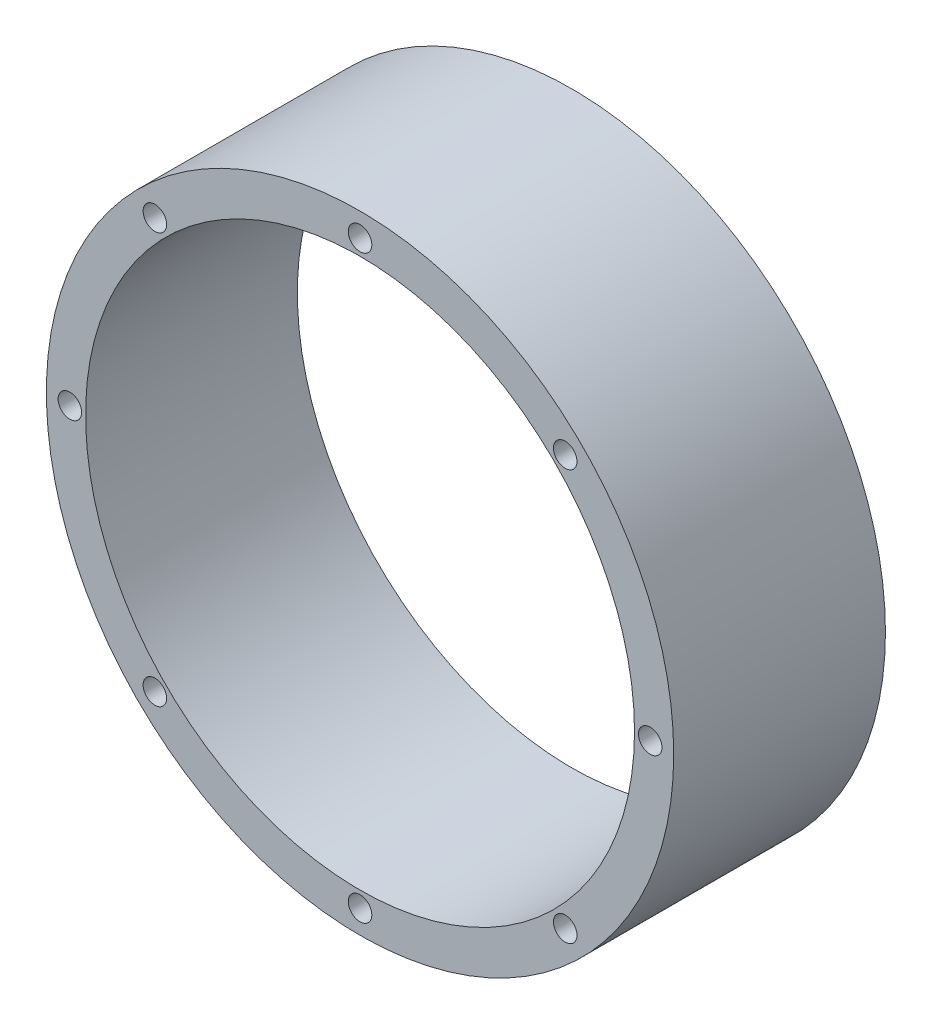
ISO-10303-21;
HEADER;
FILE_DESCRIPTION(('STEP AP214'),'2;1');
FILE_NAME('part.step','',(''),(''),'','','');
FILE_SCHEMA(('AUTOMOTIVE_DESIGN { 1 0 10303 214 1 1 1 1 }'));
ENDSEC;
DATA;
#1=APPLICATION_CONTEXT('core data for automotive mechanical design processes');
#2=APPLICATION_PROTOCOL_DEFINITION('international standard','automotive_design',2000,#1);
#3=PRODUCT_CONTEXT('',#1,'mechanical');
#4=PRODUCT('Part','Part','',(#3));
#5=PRODUCT_RELATED_PRODUCT_CATEGORY('part','',(#4));
#6=PRODUCT_DEFINITION_FORMATION('','',#4);
#7=PRODUCT_DEFINITION_CONTEXT('part definition',#1,'design');
#8=PRODUCT_DEFINITION('design','',#6,#7);
#9=PRODUCT_DEFINITION_SHAPE('','',#8);
#10=(LENGTH_UNIT() NAMED_UNIT(*) SI_UNIT(.MILLI.,.METRE.));
#11=(NAMED_UNIT(*) PLANE_ANGLE_UNIT() SI_UNIT($,.RADIAN.));
#12=(NAMED_UNIT(*) SI_UNIT($,.STERADIAN.) SOLID_ANGLE_UNIT());
#13=UNCERTAINTY_MEASURE_WITH_UNIT(LENGTH_MEASURE(1.E-05),#10,'distance_accuracy_value','');
#14=(GEOMETRIC_REPRESENTATION_CONTEXT(3) GLOBAL_UNCERTAINTY_ASSIGNED_CONTEXT((#13)) GLOBAL_UNIT_ASSIGNED_CONTEXT((#10,
#11,#12)) REPRESENTATION_CONTEXT('',''));
#15=CARTESIAN_POINT('',(0.,0.,0.));
#16=DIRECTION('',(0.,0.,1.));
#17=DIRECTION('',(1.,0.,0.));
#18=AXIS2_PLACEMENT_3D('',#15,#16,#17);
#19=CARTESIAN_POINT('',(0.,0.,27.));
#20=DIRECTION('',(0.,0.,1.));
#21=DIRECTION('',(1.,0.,0.));
#22=AXIS2_PLACEMENT_3D('',#19,#20,#21);
#23=PLANE('',#22);
#24=CARTESIAN_POINT('',(0.,37.,27.));
#25=DIRECTION('',(0.,0.,-1.));
#26=DIRECTION('',(-1.,0.,0.));
#27=AXIS2_PLACEMENT_3D('',#24,#25,#26);
#28=CIRCLE('',#27,1.5);
#29=CARTESIAN_POINT('',(-1.5,37.,27.));
#30=VERTEX_POINT('',#29);
#31=EDGE_CURVE('E143',#30,#30,#28,.T.);
#32=ORIENTED_EDGE('',*,*,#31,.T.);
#33=EDGE_LOOP('',(#32));
#34=FACE_BOUND('',#33,.T.);
#35=CARTESIAN_POINT('',(-26.1629509039018,26.1629509039011,27.));
#36=DIRECTION('',(0.,0.,-1.));
#37=DIRECTION('',(-1.,0.,0.));
#38=AXIS2_PLACEMENT_3D('',#35,#36,#37);
#39=CIRCLE('',#38,1.49999999999999);
#40=CARTESIAN_POINT('',(-27.6629509039018,26.1629509039011,27.));
#41=VERTEX_POINT('',#40);
#42=EDGE_CURVE('E131',#41,#41,#39,.T.);
#43=ORIENTED_EDGE('',*,*,#42,.T.);
#44=EDGE_LOOP('',(#43));
#45=FACE_BOUND('',#44,.T.);
#46=CARTESIAN_POINT('',(-36.9999999999984,-1.575139276809E-12,27.));
#47=DIRECTION('',(0.,0.,-1.));
#48=DIRECTION('',(-1.,0.,0.));
#49=AXIS2_PLACEMENT_3D('',#46,#47,#48);
#50=CIRCLE('',#49,1.49999999999999);
#51=CARTESIAN_POINT('',(-38.4999999999984,-1.575139276809E-12,27.));
#52=VERTEX_POINT('',#51);
#53=EDGE_CURVE('E119',#52,#52,#50,.T.);
#54=ORIENTED_EDGE('',*,*,#53,.T.);
#55=EDGE_LOOP('',(#54));
#56=FACE_BOUND('',#55,.T.);
#57=CARTESIAN_POINT('',(26.1629509039027,26.1629509039034,27.));
#58=DIRECTION('',(0.,0.,-1.));
#59=DIRECTION('',(-1.,0.,0.));
#60=AXIS2_PLACEMENT_3D('',#57,#58,#59);
#61=CIRCLE('',#60,1.49999999999999);
#62=CARTESIAN_POINT('',(24.6629509039027,26.1629509039034,27.));
#63=VERTEX_POINT('',#62);
#64=EDGE_CURVE('E107',#63,#63,#61,.T.);
#65=ORIENTED_EDGE('',*,*,#64,.T.);
#66=EDGE_LOOP('',(#65));
#67=FACE_BOUND('',#66,.T.);
#68=CARTESIAN_POINT('',(37.0000000000016,1.57060808365215E-12,27.));
#69=DIRECTION('',(0.,0.,-1.));
#70=DIRECTION('',(-1.,0.,0.));
#71=AXIS2_PLACEMENT_3D('',#68,#69,#70);
#72=CIRCLE('',#71,1.49999999999999);
#73=CARTESIAN_POINT('',(35.5000000000016,1.57060808365215E-12,27.));
#74=VERTEX_POINT('',#73);
#75=EDGE_CURVE('E95',#74,#74,#72,.T.);
#76=ORIENTED_EDGE('',*,*,#75,.T.);
#77=EDGE_LOOP('',(#76));
#78=FACE_BOUND('',#77,.T.);
#79=CARTESIAN_POINT('',(26.1629509039049,-26.1629509039011,27.));
#80=DIRECTION('',(0.,0.,-1.));
#81=DIRECTION('',(-1.,0.,0.));
#82=AXIS2_PLACEMENT_3D('',#79,#80,#81);
#83=CIRCLE('',#82,1.49999999999999);
#84=CARTESIAN_POINT('',(24.6629509039049,-26.1629509039011,27.));
#85=VERTEX_POINT('',#84);
#86=EDGE_CURVE('E83',#85,#85,#83,.T.);
#87=ORIENTED_EDGE('',*,*,#86,.T.);
#88=EDGE_LOOP('',(#87));
#89=FACE_BOUND('',#88,.T.);
#90=CARTESIAN_POINT('',(3.14121616730431E-12,-37.,27.));
#91=DIRECTION('',(0.,0.,-1.));
#92=DIRECTION('',(-1.,0.,0.));
#93=AXIS2_PLACEMENT_3D('',#90,#91,#92);
#94=CIRCLE('',#93,1.5);
#95=CARTESIAN_POINT('',(-1.49999999999685,-37.,27.));
#96=VERTEX_POINT('',#95);
#97=EDGE_CURVE('E71',#96,#96,#94,.T.);
#98=ORIENTED_EDGE('',*,*,#97,.T.);
#99=EDGE_LOOP('',(#98));
#100=FACE_BOUND('',#99,.T.);
#101=CARTESIAN_POINT('',(-26.1629509038996,-26.1629509039034,27.));
#102=DIRECTION('',(0.,0.,-1.));
#103=DIRECTION('',(-1.,0.,0.));
#104=AXIS2_PLACEMENT_3D('',#101,#102,#103);
#105=CIRCLE('',#104,1.49999999999999);
#106=CARTESIAN_POINT('',(-27.6629509038996,-26.1629509039034,27.));
#107=VERTEX_POINT('',#106);
#108=EDGE_CURVE('E56',#107,#107,#105,.T.);
#109=ORIENTED_EDGE('',*,*,#108,.T.);
#110=EDGE_LOOP('',(#109));
#111=FACE_BOUND('',#110,.T.);
#112=CARTESIAN_POINT('',(0.,0.,27.));
#113=DIRECTION('',(0.,0.,1.));
#114=DIRECTION('',(1.,0.,0.));
#115=AXIS2_PLACEMENT_3D('',#112,#113,#114);
#116=CIRCLE('',#115,40.);
#117=CARTESIAN_POINT('',(40.,0.,27.));
#118=VERTEX_POINT('',#117);
#119=EDGE_CURVE('E10',#118,#118,#116,.T.);
#120=ORIENTED_EDGE('',*,*,#119,.T.);
#121=EDGE_LOOP('',(#120));
#122=FACE_BOUND('',#121,.T.);
#123=CARTESIAN_POINT('',(0.,0.,27.));
#124=DIRECTION('',(0.,0.,1.));
#125=DIRECTION('',(1.,0.,0.));
#126=AXIS2_PLACEMENT_3D('',#123,#124,#125);
#127=CIRCLE('',#126,35.);
#128=CARTESIAN_POINT('',(35.,0.,27.));
#129=VERTEX_POINT('',#128);
#130=EDGE_CURVE('E50',#129,#129,#127,.T.);
#131=ORIENTED_EDGE('',*,*,#130,.F.);
#132=EDGE_LOOP('',(#131));
#133=FACE_BOUND('',#132,.T.);
#134=ADVANCED_FACE('F37',(#34,#45,#56,#67,#78,#89,#100,#111,#122,#133),#23,.T.);
#135=CARTESIAN_POINT('',(0.,0.,0.));
#136=DIRECTION('',(0.,0.,1.));
#137=DIRECTION('',(1.,0.,0.));
#138=AXIS2_PLACEMENT_3D('',#135,#136,#137);
#139=PLANE('',#138);
#140=CARTESIAN_POINT('',(0.,37.,0.));
#141=DIRECTION('',(0.,0.,-1.));
#142=DIRECTION('',(-1.,0.,0.));
#143=AXIS2_PLACEMENT_3D('',#140,#141,#142);
#144=CIRCLE('',#143,1.525);
#145=CARTESIAN_POINT('',(-1.525,37.,0.));
#146=VERTEX_POINT('',#145);
#147=EDGE_CURVE('E151',#146,#146,#144,.T.);
#148=ORIENTED_EDGE('',*,*,#147,.F.);
#149=EDGE_LOOP('',(#148));
#150=FACE_BOUND('',#149,.T.);
#151=CARTESIAN_POINT('',(-26.1629509039018,26.1629509039011,0.));
#152=DIRECTION('',(0.,0.,-1.));
#153=DIRECTION('',(-1.,0.,0.));
#154=AXIS2_PLACEMENT_3D('',#151,#152,#153);
#155=CIRCLE('',#154,1.525);
#156=CARTESIAN_POINT('',(-27.6879509039018,26.1629509039011,0.));
#157=VERTEX_POINT('',#156);
#158=EDGE_CURVE('E139',#157,#157,#155,.T.);
#159=ORIENTED_EDGE('',*,*,#158,.F.);
#160=EDGE_LOOP('',(#159));
#161=FACE_BOUND('',#160,.T.);
#162=CARTESIAN_POINT('',(-36.9999999999984,-1.575139276809E-12,0.));
#163=DIRECTION('',(0.,0.,-1.));
#164=DIRECTION('',(-1.,0.,0.));
#165=AXIS2_PLACEMENT_3D('',#162,#163,#164);
#166=CIRCLE('',#165,1.525);
#167=CARTESIAN_POINT('',(-38.5249999999984,-1.575139276809E-12,0.));
#168=VERTEX_POINT('',#167);
#169=EDGE_CURVE('E127',#168,#168,#166,.T.);
#170=ORIENTED_EDGE('',*,*,#169,.F.);
#171=EDGE_LOOP('',(#170));
#172=FACE_BOUND('',#171,.T.);
#173=CARTESIAN_POINT('',(26.1629509039027,26.1629509039034,0.));
#174=DIRECTION('',(0.,0.,-1.));
#175=DIRECTION('',(-1.,0.,0.));
#176=AXIS2_PLACEMENT_3D('',#173,#174,#175);
#177=CIRCLE('',#176,1.525);
#178=CARTESIAN_POINT('',(24.6379509039027,26.1629509039034,0.));
#179=VERTEX_POINT('',#178);
#180=EDGE_CURVE('E115',#179,#179,#177,.T.);
#181=ORIENTED_EDGE('',*,*,#180,.F.);
#182=EDGE_LOOP('',(#181));
#183=FACE_BOUND('',#182,.T.);
#184=CARTESIAN_POINT('',(37.0000000000016,1.57060808365215E-12,0.));
#185=DIRECTION('',(0.,0.,-1.));
#186=DIRECTION('',(-1.,0.,0.));
#187=AXIS2_PLACEMENT_3D('',#184,#185,#186);
#188=CIRCLE('',#187,1.525);
#189=CARTESIAN_POINT('',(35.4750000000016,1.57060808365215E-12,0.));
#190=VERTEX_POINT('',#189);
#191=EDGE_CURVE('E103',#190,#190,#188,.T.);
#192=ORIENTED_EDGE('',*,*,#191,.F.);
#193=EDGE_LOOP('',(#192));
#194=FACE_BOUND('',#193,.T.);
#195=CARTESIAN_POINT('',(26.1629509039049,-26.1629509039011,0.));
#196=DIRECTION('',(0.,0.,-1.));
#197=DIRECTION('',(-1.,0.,0.));
#198=AXIS2_PLACEMENT_3D('',#195,#196,#197);
#199=CIRCLE('',#198,1.525);
#200=CARTESIAN_POINT('',(24.6379509039049,-26.1629509039011,0.));
#201=VERTEX_POINT('',#200);
#202=EDGE_CURVE('E91',#201,#201,#199,.T.);
#203=ORIENTED_EDGE('',*,*,#202,.F.);
#204=EDGE_LOOP('',(#203));
#205=FACE_BOUND('',#204,.T.);
#206=CARTESIAN_POINT('',(3.14121616730431E-12,-37.,0.));
#207=DIRECTION('',(0.,0.,-1.));
#208=DIRECTION('',(-1.,0.,0.));
#209=AXIS2_PLACEMENT_3D('',#206,#207,#208);
#210=CIRCLE('',#209,1.525);
#211=CARTESIAN_POINT('',(-1.52499999999686,-37.,0.));
#212=VERTEX_POINT('',#211);
#213=EDGE_CURVE('E79',#212,#212,#210,.T.);
#214=ORIENTED_EDGE('',*,*,#213,.F.);
#215=EDGE_LOOP('',(#214));
#216=FACE_BOUND('',#215,.T.);
#217=CARTESIAN_POINT('',(-26.1629509038996,-26.1629509039034,0.));
#218=DIRECTION('',(0.,0.,-1.));
#219=DIRECTION('',(-1.,0.,0.));
#220=AXIS2_PLACEMENT_3D('',#217,#218,#219);
#221=CIRCLE('',#220,1.525);
#222=CARTESIAN_POINT('',(-27.6879509038996,-26.1629509039034,0.));
#223=VERTEX_POINT('',#222);
#224=EDGE_CURVE('E67',#223,#223,#221,.T.);
#225=ORIENTED_EDGE('',*,*,#224,.F.);
#226=EDGE_LOOP('',(#225));
#227=FACE_BOUND('',#226,.T.);
#228=CARTESIAN_POINT('',(0.,0.,0.));
#229=DIRECTION('',(0.,0.,1.));
#230=DIRECTION('',(1.,0.,0.));
#231=AXIS2_PLACEMENT_3D('',#228,#229,#230);
#232=CIRCLE('',#231,40.);
#233=CARTESIAN_POINT('',(40.,0.,0.));
#234=VERTEX_POINT('',#233);
#235=EDGE_CURVE('E41',#234,#234,#232,.T.);
#236=ORIENTED_EDGE('',*,*,#235,.F.);
#237=EDGE_LOOP('',(#236));
#238=FACE_BOUND('',#237,.T.);
#239=CARTESIAN_POINT('',(0.,0.,0.));
#240=DIRECTION('',(0.,0.,1.));
#241=DIRECTION('',(1.,0.,0.));
#242=AXIS2_PLACEMENT_3D('',#239,#240,#241);
#243=CIRCLE('',#242,35.);
#244=CARTESIAN_POINT('',(35.,0.,0.));
#245=VERTEX_POINT('',#244);
#246=EDGE_CURVE('E52',#245,#245,#243,.T.);
#247=ORIENTED_EDGE('',*,*,#246,.T.);
#248=EDGE_LOOP('',(#247));
#249=FACE_BOUND('',#248,.T.);
#250=ADVANCED_FACE('F158',(#150,#161,#172,#183,#194,#205,#216,#227,#238,#249),#139,.F.);
#251=CARTESIAN_POINT('',(0.,0.,27.));
#252=DIRECTION('',(0.,0.,-1.));
#253=DIRECTION('',(-1.,0.,0.));
#254=AXIS2_PLACEMENT_3D('',#251,#252,#253);
#255=CYLINDRICAL_SURFACE('',#254,40.);
#256=ORIENTED_EDGE('',*,*,#119,.F.);
#257=EDGE_LOOP('',(#256));
#258=FACE_BOUND('',#257,.T.);
#259=ORIENTED_EDGE('',*,*,#235,.T.);
#260=EDGE_LOOP('',(#259));
#261=FACE_BOUND('',#260,.T.);
#262=ADVANCED_FACE('F39',(#258,#261),#255,.T.);
#263=CARTESIAN_POINT('',(0.,0.,27.));
#264=DIRECTION('',(0.,0.,-1.));
#265=DIRECTION('',(-1.,0.,0.));
#266=AXIS2_PLACEMENT_3D('',#263,#264,#265);
#267=CYLINDRICAL_SURFACE('',#266,35.);
#268=ORIENTED_EDGE('',*,*,#130,.T.);
#269=EDGE_LOOP('',(#268));
#270=FACE_BOUND('',#269,.T.);
#271=ORIENTED_EDGE('',*,*,#246,.F.);
#272=EDGE_LOOP('',(#271));
#273=FACE_BOUND('',#272,.T.);
#274=ADVANCED_FACE('F179',(#270,#273),#267,.F.);
#275=CARTESIAN_POINT('',(-26.1629509038996,-26.1629509039034,0.));
#276=DIRECTION('',(0.,0.,-1.));
#277=DIRECTION('',(-1.,0.,0.));
#278=AXIS2_PLACEMENT_3D('',#275,#276,#277);
#279=CYLINDRICAL_SURFACE('',#278,1.5);
#280=ORIENTED_EDGE('',*,*,#108,.F.);
#281=EDGE_LOOP('',(#280));
#282=FACE_BOUND('',#281,.T.);
#283=CARTESIAN_POINT('',(-26.1629509038996,-26.1629509039034,0.0250000000000007));
#284=DIRECTION('',(0.,0.,-1.));
#285=DIRECTION('',(-1.,0.,0.));
#286=AXIS2_PLACEMENT_3D('',#283,#284,#285);
#287=CIRCLE('',#286,1.5);
#288=CARTESIAN_POINT('',(-27.6629509038996,-26.1629509039034,0.0250000000000007));
#289=VERTEX_POINT('',#288);
#290=EDGE_CURVE('E63',#289,#289,#287,.T.);
#291=ORIENTED_EDGE('',*,*,#290,.T.);
#292=EDGE_LOOP('',(#291));
#293=FACE_BOUND('',#292,.T.);
#294=ADVANCED_FACE('F181',(#282,#293),#279,.F.);
#295=CARTESIAN_POINT('',(-26.1629509038996,-26.1629509039034,0.));
#296=DIRECTION('',(0.,0.,-1.));
#297=DIRECTION('',(-1.,0.,0.));
#298=AXIS2_PLACEMENT_3D('',#295,#296,#297);
#299=CONICAL_SURFACE('',#298,1.525,0.785398163397448);
#300=ORIENTED_EDGE('',*,*,#290,.F.);
#301=EDGE_LOOP('',(#300));
#302=FACE_BOUND('',#301,.T.);
#303=ORIENTED_EDGE('',*,*,#224,.T.);
#304=EDGE_LOOP('',(#303));
#305=FACE_BOUND('',#304,.T.);
#306=ADVANCED_FACE('F188',(#302,#305),#299,.F.);
#307=CARTESIAN_POINT('',(3.14121616730431E-12,-37.,0.));
#308=DIRECTION('',(0.,0.,-1.));
#309=DIRECTION('',(-1.,0.,0.));
#310=AXIS2_PLACEMENT_3D('',#307,#308,#309);
#311=CYLINDRICAL_SURFACE('',#310,1.5);
#312=ORIENTED_EDGE('',*,*,#97,.F.);
#313=EDGE_LOOP('',(#312));
#314=FACE_BOUND('',#313,.T.);
#315=CARTESIAN_POINT('',(3.14121616730431E-12,-37.,0.0250000000000007));
#316=DIRECTION('',(0.,0.,-1.));
#317=DIRECTION('',(-1.,0.,0.));
#318=AXIS2_PLACEMENT_3D('',#315,#316,#317);
#319=CIRCLE('',#318,1.5);
#320=CARTESIAN_POINT('',(-1.49999999999686,-37.,0.0250000000000007));
#321=VERTEX_POINT('',#320);
#322=EDGE_CURVE('E75',#321,#321,#319,.T.);
#323=ORIENTED_EDGE('',*,*,#322,.T.);
#324=EDGE_LOOP('',(#323));
#325=FACE_BOUND('',#324,.T.);
#326=ADVANCED_FACE('F219',(#314,#325),#311,.F.);
#327=CARTESIAN_POINT('',(3.14121616730431E-12,-37.,0.));
#328=DIRECTION('',(0.,0.,-1.));
#329=DIRECTION('',(-1.,0.,0.));
#330=AXIS2_PLACEMENT_3D('',#327,#328,#329);
#331=CONICAL_SURFACE('',#330,1.525,0.785398163397448);
#332=ORIENTED_EDGE('',*,*,#322,.F.);
#333=EDGE_LOOP('',(#332));
#334=FACE_BOUND('',#333,.T.);
#335=ORIENTED_EDGE('',*,*,#213,.T.);
#336=EDGE_LOOP('',(#335));
#337=FACE_BOUND('',#336,.T.);
#338=ADVANCED_FACE('F224',(#334,#337),#331,.F.);
#339=CARTESIAN_POINT('',(26.1629509039049,-26.1629509039011,0.));
#340=DIRECTION('',(0.,0.,-1.));
#341=DIRECTION('',(-1.,0.,0.));
#342=AXIS2_PLACEMENT_3D('',#339,#340,#341);
#343=CYLINDRICAL_SURFACE('',#342,1.5);
#344=ORIENTED_EDGE('',*,*,#86,.F.);
#345=EDGE_LOOP('',(#344));
#346=FACE_BOUND('',#345,.T.);
#347=CARTESIAN_POINT('',(26.1629509039049,-26.1629509039011,0.0250000000000007));
#348=DIRECTION('',(0.,0.,-1.));
#349=DIRECTION('',(-1.,0.,0.));
#350=AXIS2_PLACEMENT_3D('',#347,#348,#349);
#351=CIRCLE('',#350,1.5);
#352=CARTESIAN_POINT('',(24.6629509039049,-26.1629509039011,0.0250000000000007));
#353=VERTEX_POINT('',#352);
#354=EDGE_CURVE('E87',#353,#353,#351,.T.);
#355=ORIENTED_EDGE('',*,*,#354,.T.);
#356=EDGE_LOOP('',(#355));
#357=FACE_BOUND('',#356,.T.);
#358=ADVANCED_FACE('F230',(#346,#357),#343,.F.);
#359=CARTESIAN_POINT('',(26.1629509039049,-26.1629509039011,0.));
#360=DIRECTION('',(0.,0.,-1.));
#361=DIRECTION('',(-1.,0.,0.));
#362=AXIS2_PLACEMENT_3D('',#359,#360,#361);
#363=CONICAL_SURFACE('',#362,1.525,0.785398163397448);
#364=ORIENTED_EDGE('',*,*,#354,.F.);
#365=EDGE_LOOP('',(#364));
#366=FACE_BOUND('',#365,.T.);
#367=ORIENTED_EDGE('',*,*,#202,.T.);
#368=EDGE_LOOP('',(#367));
#369=FACE_BOUND('',#368,.T.);
#370=ADVANCED_FACE('F234',(#366,#369),#363,.F.);
#371=CARTESIAN_POINT('',(37.0000000000016,1.57060808365215E-12,0.));
#372=DIRECTION('',(0.,0.,-1.));
#373=DIRECTION('',(-1.,0.,0.));
#374=AXIS2_PLACEMENT_3D('',#371,#372,#373);
#375=CYLINDRICAL_SURFACE('',#374,1.5);
#376=ORIENTED_EDGE('',*,*,#75,.F.);
#377=EDGE_LOOP('',(#376));
#378=FACE_BOUND('',#377,.T.);
#379=CARTESIAN_POINT('',(37.0000000000016,1.57060808365215E-12,0.0250000000000007));
#380=DIRECTION('',(0.,0.,-1.));
#381=DIRECTION('',(-1.,0.,0.));
#382=AXIS2_PLACEMENT_3D('',#379,#380,#381);
#383=CIRCLE('',#382,1.5);
#384=CARTESIAN_POINT('',(35.5000000000016,1.57060808365215E-12,0.0250000000000007));
#385=VERTEX_POINT('',#384);
#386=EDGE_CURVE('E99',#385,#385,#383,.T.);
#387=ORIENTED_EDGE('',*,*,#386,.T.);
#388=EDGE_LOOP('',(#387));
#389=FACE_BOUND('',#388,.T.);
#390=ADVANCED_FACE('F238',(#378,#389),#375,.F.);
#391=CARTESIAN_POINT('',(37.0000000000016,1.57060808365215E-12,0.));
#392=DIRECTION('',(0.,0.,-1.));
#393=DIRECTION('',(-1.,0.,0.));
#394=AXIS2_PLACEMENT_3D('',#391,#392,#393);
#395=CONICAL_SURFACE('',#394,1.525,0.785398163397379);
#396=ORIENTED_EDGE('',*,*,#386,.F.);
#397=EDGE_LOOP('',(#396));
#398=FACE_BOUND('',#397,.T.);
#399=ORIENTED_EDGE('',*,*,#191,.T.);
#400=EDGE_LOOP('',(#399));
#401=FACE_BOUND('',#400,.T.);
#402=ADVANCED_FACE('F242',(#398,#401),#395,.F.);
#403=CARTESIAN_POINT('',(26.1629509039027,26.1629509039034,0.));
#404=DIRECTION('',(0.,0.,-1.));
#405=DIRECTION('',(-1.,0.,0.));
#406=AXIS2_PLACEMENT_3D('',#403,#404,#405);
#407=CYLINDRICAL_SURFACE('',#406,1.5);
#408=ORIENTED_EDGE('',*,*,#64,.F.);
#409=EDGE_LOOP('',(#408));
#410=FACE_BOUND('',#409,.T.);
#411=CARTESIAN_POINT('',(26.1629509039027,26.1629509039034,0.0250000000000007));
#412=DIRECTION('',(0.,0.,-1.));
#413=DIRECTION('',(-1.,0.,0.));
#414=AXIS2_PLACEMENT_3D('',#411,#412,#413);
#415=CIRCLE('',#414,1.5);
#416=CARTESIAN_POINT('',(24.6629509039027,26.1629509039034,0.0250000000000007));
#417=VERTEX_POINT('',#416);
#418=EDGE_CURVE('E111',#417,#417,#415,.T.);
#419=ORIENTED_EDGE('',*,*,#418,.T.);
#420=EDGE_LOOP('',(#419));
#421=FACE_BOUND('',#420,.T.);
#422=ADVANCED_FACE('F246',(#410,#421),#407,.F.);
#423=CARTESIAN_POINT('',(26.1629509039027,26.1629509039034,0.));
#424=DIRECTION('',(0.,0.,-1.));
#425=DIRECTION('',(-1.,0.,0.));
#426=AXIS2_PLACEMENT_3D('',#423,#424,#425);
#427=CONICAL_SURFACE('',#426,1.525,0.785398163397448);
#428=ORIENTED_EDGE('',*,*,#418,.F.);
#429=EDGE_LOOP('',(#428));
#430=FACE_BOUND('',#429,.T.);
#431=ORIENTED_EDGE('',*,*,#180,.T.);
#432=EDGE_LOOP('',(#431));
#433=FACE_BOUND('',#432,.T.);
#434=ADVANCED_FACE('F250',(#430,#433),#427,.F.);
#435=CARTESIAN_POINT('',(-36.9999999999984,-1.575139276809E-12,0.));
#436=DIRECTION('',(0.,0.,-1.));
#437=DIRECTION('',(-1.,0.,0.));
#438=AXIS2_PLACEMENT_3D('',#435,#436,#437);
#439=CYLINDRICAL_SURFACE('',#438,1.5);
#440=ORIENTED_EDGE('',*,*,#53,.F.);
#441=EDGE_LOOP('',(#440));
#442=FACE_BOUND('',#441,.T.);
#443=CARTESIAN_POINT('',(-36.9999999999984,-1.575139276809E-12,0.0250000000000007));
#444=DIRECTION('',(0.,0.,-1.));
#445=DIRECTION('',(-1.,0.,0.));
#446=AXIS2_PLACEMENT_3D('',#443,#444,#445);
#447=CIRCLE('',#446,1.5);
#448=CARTESIAN_POINT('',(-38.4999999999984,-1.575139276809E-12,0.0250000000000007));
#449=VERTEX_POINT('',#448);
#450=EDGE_CURVE('E123',#449,#449,#447,.T.);
#451=ORIENTED_EDGE('',*,*,#450,.T.);
#452=EDGE_LOOP('',(#451));
#453=FACE_BOUND('',#452,.T.);
#454=ADVANCED_FACE('F254',(#442,#453),#439,.F.);
#455=CARTESIAN_POINT('',(-36.9999999999984,-1.575139276809E-12,0.));
#456=DIRECTION('',(0.,0.,-1.));
#457=DIRECTION('',(-1.,0.,0.));
#458=AXIS2_PLACEMENT_3D('',#455,#456,#457);
#459=CONICAL_SURFACE('',#458,1.525,0.785398163397379);
#460=ORIENTED_EDGE('',*,*,#450,.F.);
#461=EDGE_LOOP('',(#460));
#462=FACE_BOUND('',#461,.T.);
#463=ORIENTED_EDGE('',*,*,#169,.T.);
#464=EDGE_LOOP('',(#463));
#465=FACE_BOUND('',#464,.T.);
#466=ADVANCED_FACE('F258',(#462,#465),#459,.F.);
#467=CARTESIAN_POINT('',(-26.1629509039018,26.1629509039011,0.));
#468=DIRECTION('',(0.,0.,-1.));
#469=DIRECTION('',(-1.,0.,0.));
#470=AXIS2_PLACEMENT_3D('',#467,#468,#469);
#471=CYLINDRICAL_SURFACE('',#470,1.5);
#472=ORIENTED_EDGE('',*,*,#42,.F.);
#473=EDGE_LOOP('',(#472));
#474=FACE_BOUND('',#473,.T.);
#475=CARTESIAN_POINT('',(-26.1629509039018,26.1629509039011,0.0250000000000007));
#476=DIRECTION('',(0.,0.,-1.));
#477=DIRECTION('',(-1.,0.,0.));
#478=AXIS2_PLACEMENT_3D('',#475,#476,#477);
#479=CIRCLE('',#478,1.5);
#480=CARTESIAN_POINT('',(-27.6629509039018,26.1629509039011,0.0250000000000007));
#481=VERTEX_POINT('',#480);
#482=EDGE_CURVE('E135',#481,#481,#479,.T.);
#483=ORIENTED_EDGE('',*,*,#482,.T.);
#484=EDGE_LOOP('',(#483));
#485=FACE_BOUND('',#484,.T.);
#486=ADVANCED_FACE('F262',(#474,#485),#471,.F.);
#487=CARTESIAN_POINT('',(-26.1629509039018,26.1629509039011,0.));
#488=DIRECTION('',(0.,0.,-1.));
#489=DIRECTION('',(-1.,0.,0.));
#490=AXIS2_PLACEMENT_3D('',#487,#488,#489);
#491=CONICAL_SURFACE('',#490,1.525,0.785398163397448);
#492=ORIENTED_EDGE('',*,*,#482,.F.);
#493=EDGE_LOOP('',(#492));
#494=FACE_BOUND('',#493,.T.);
#495=ORIENTED_EDGE('',*,*,#158,.T.);
#496=EDGE_LOOP('',(#495));
#497=FACE_BOUND('',#496,.T.);
#498=ADVANCED_FACE('F266',(#494,#497),#491,.F.);
#499=CARTESIAN_POINT('',(0.,37.,0.));
#500=DIRECTION('',(0.,0.,-1.));
#501=DIRECTION('',(-1.,0.,0.));
#502=AXIS2_PLACEMENT_3D('',#499,#500,#501);
#503=CYLINDRICAL_SURFACE('',#502,1.5);
#504=ORIENTED_EDGE('',*,*,#31,.F.);
#505=EDGE_LOOP('',(#504));
#506=FACE_BOUND('',#505,.T.);
#507=CARTESIAN_POINT('',(0.,37.,0.0250000000000007));
#508=DIRECTION('',(0.,0.,-1.));
#509=DIRECTION('',(-1.,0.,0.));
#510=AXIS2_PLACEMENT_3D('',#507,#508,#509);
#511=CIRCLE('',#510,1.5);
#512=CARTESIAN_POINT('',(-1.5,37.,0.0250000000000007));
#513=VERTEX_POINT('',#512);
#514=EDGE_CURVE('E147',#513,#513,#511,.T.);
#515=ORIENTED_EDGE('',*,*,#514,.T.);
#516=EDGE_LOOP('',(#515));
#517=FACE_BOUND('',#516,.T.);
#518=ADVANCED_FACE('F270',(#506,#517),#503,.F.);
#519=CARTESIAN_POINT('',(0.,37.,0.));
#520=DIRECTION('',(0.,0.,-1.));
#521=DIRECTION('',(-1.,0.,0.));
#522=AXIS2_PLACEMENT_3D('',#519,#520,#521);
#523=CONICAL_SURFACE('',#522,1.525,0.785398163397448);
#524=ORIENTED_EDGE('',*,*,#514,.F.);
#525=EDGE_LOOP('',(#524));
#526=FACE_BOUND('',#525,.T.);
#527=ORIENTED_EDGE('',*,*,#147,.T.);
#528=EDGE_LOOP('',(#527));
#529=FACE_BOUND('',#528,.T.);
#530=ADVANCED_FACE('F156',(#526,#529),#523,.F.);
#531=CLOSED_SHELL('',(#134,#250,#262,#274,#294,#306,#326,#338,#358,#370,#390,#402,#422,#434,
#454,#466,#486,#498,#518,#530));
#532=MANIFOLD_SOLID_BREP('B2',#531);
#533=ADVANCED_BREP_SHAPE_REPRESENTATION('',(#18,#532),#14);
#534=SHAPE_DEFINITION_REPRESENTATION(#9,#533);
ENDSEC;
END-ISO-10303-21;
